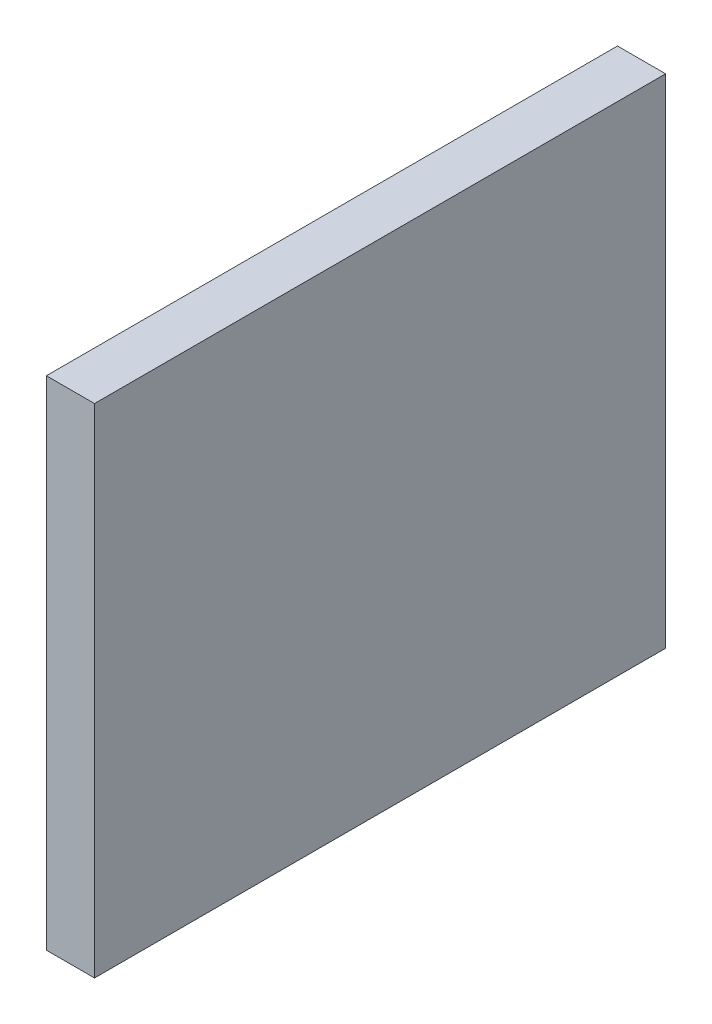
ISO-10303-21;
HEADER;
FILE_DESCRIPTION(('STEP AP214'),'2;1');
FILE_NAME('part.step','',(''),(''),'','','');
FILE_SCHEMA(('AUTOMOTIVE_DESIGN { 1 0 10303 214 1 1 1 1 }'));
ENDSEC;
DATA;
#1=APPLICATION_CONTEXT('core data for automotive mechanical design processes');
#2=APPLICATION_PROTOCOL_DEFINITION('international standard','automotive_design',2000,#1);
#3=PRODUCT_CONTEXT('',#1,'mechanical');
#4=PRODUCT('Part','Part','',(#3));
#5=PRODUCT_RELATED_PRODUCT_CATEGORY('part','',(#4));
#6=PRODUCT_DEFINITION_FORMATION('','',#4);
#7=PRODUCT_DEFINITION_CONTEXT('part definition',#1,'design');
#8=PRODUCT_DEFINITION('design','',#6,#7);
#9=PRODUCT_DEFINITION_SHAPE('','',#8);
#10=(LENGTH_UNIT() NAMED_UNIT(*) SI_UNIT(.MILLI.,.METRE.));
#11=(NAMED_UNIT(*) PLANE_ANGLE_UNIT() SI_UNIT($,.RADIAN.));
#12=(NAMED_UNIT(*) SI_UNIT($,.STERADIAN.) SOLID_ANGLE_UNIT());
#13=UNCERTAINTY_MEASURE_WITH_UNIT(LENGTH_MEASURE(1.E-05),#10,'distance_accuracy_value','');
#14=(GEOMETRIC_REPRESENTATION_CONTEXT(3) GLOBAL_UNCERTAINTY_ASSIGNED_CONTEXT((#13)) GLOBAL_UNIT_ASSIGNED_CONTEXT((#10,
#11,#12)) REPRESENTATION_CONTEXT('',''));
#15=CARTESIAN_POINT('',(0.,0.,0.));
#16=DIRECTION('',(0.,0.,1.));
#17=DIRECTION('',(1.,0.,0.));
#18=AXIS2_PLACEMENT_3D('',#15,#16,#17);
#19=CARTESIAN_POINT('',(0.,0.,0.));
#20=DIRECTION('',(0.,0.,1.));
#21=DIRECTION('',(1.,0.,0.));
#22=AXIS2_PLACEMENT_3D('',#19,#20,#21);
#23=PLANE('',#22);
#24=DIRECTION('',(1.,0.,0.));
#25=VECTOR('',#24,1.);
#26=CARTESIAN_POINT('',(-210.,-250.,0.));
#27=LINE('',#26,#25);
#28=CARTESIAN_POINT('',(-210.,-250.,0.));
#29=VERTEX_POINT('',#28);
#30=CARTESIAN_POINT('',(-190.95,-250.,0.));
#31=VERTEX_POINT('',#30);
#32=EDGE_CURVE('E83',#29,#31,#27,.T.);
#33=ORIENTED_EDGE('',*,*,#32,.F.);
#34=DIRECTION('',(0.,-1.,0.));
#35=VECTOR('',#34,1.);
#36=CARTESIAN_POINT('',(-210.,-53.1314680617709,0.));
#37=LINE('',#36,#35);
#38=CARTESIAN_POINT('',(-210.,-53.1314680617709,0.));
#39=VERTEX_POINT('',#38);
#40=EDGE_CURVE('E94',#39,#29,#37,.T.);
#41=ORIENTED_EDGE('',*,*,#40,.F.);
#42=DIRECTION('',(-1.,0.,0.));
#43=VECTOR('',#42,1.);
#44=CARTESIAN_POINT('',(-190.95,-53.1314680617709,0.));
#45=LINE('',#44,#43);
#46=CARTESIAN_POINT('',(-190.95,-53.1314680617709,0.));
#47=VERTEX_POINT('',#46);
#48=EDGE_CURVE('E85',#47,#39,#45,.T.);
#49=ORIENTED_EDGE('',*,*,#48,.F.);
#50=DIRECTION('',(0.,1.,0.));
#51=VECTOR('',#50,1.);
#52=CARTESIAN_POINT('',(-190.95,-250.,0.));
#53=LINE('',#52,#51);
#54=EDGE_CURVE('E75',#31,#47,#53,.T.);
#55=ORIENTED_EDGE('',*,*,#54,.F.);
#56=EDGE_LOOP('',(#33,#41,#49,#55));
#57=FACE_BOUND('',#56,.T.);
#58=ADVANCED_FACE('F33',(#57),#23,.F.);
#59=CARTESIAN_POINT('',(-210.,-53.1314680617709,423.78807185347));
#60=DIRECTION('',(1.,0.,0.));
#61=DIRECTION('',(0.,1.,0.));
#62=AXIS2_PLACEMENT_3D('',#59,#60,#61);
#63=PLANE('',#62);
#64=DIRECTION('',(0.,0.,-1.));
#65=VECTOR('',#64,1.);
#66=CARTESIAN_POINT('',(-210.,-250.,423.78807185347));
#67=LINE('',#66,#65);
#68=CARTESIAN_POINT('',(-210.,-250.,226.));
#69=VERTEX_POINT('',#68);
#70=EDGE_CURVE('E88',#69,#29,#67,.T.);
#71=ORIENTED_EDGE('',*,*,#70,.F.);
#72=DIRECTION('',(0.,1.,0.));
#73=VECTOR('',#72,1.);
#74=CARTESIAN_POINT('',(-210.,-53.1314680617709,226.));
#75=LINE('',#74,#73);
#76=CARTESIAN_POINT('',(-210.,-53.1314680617709,226.));
#77=VERTEX_POINT('',#76);
#78=EDGE_CURVE('E37',#69,#77,#75,.T.);
#79=ORIENTED_EDGE('',*,*,#78,.T.);
#80=DIRECTION('',(0.,0.,-1.));
#81=VECTOR('',#80,1.);
#82=CARTESIAN_POINT('',(-210.,-53.1314680617709,423.78807185347));
#83=LINE('',#82,#81);
#84=EDGE_CURVE('E97',#77,#39,#83,.T.);
#85=ORIENTED_EDGE('',*,*,#84,.T.);
#86=ORIENTED_EDGE('',*,*,#40,.T.);
#87=EDGE_LOOP('',(#71,#79,#85,#86));
#88=FACE_BOUND('',#87,.T.);
#89=ADVANCED_FACE('F106',(#88),#63,.F.);
#90=CARTESIAN_POINT('',(-190.95,-53.1314680617709,423.78807185347));
#91=DIRECTION('',(0.,-1.,0.));
#92=DIRECTION('',(0.,0.,-1.));
#93=AXIS2_PLACEMENT_3D('',#90,#91,#92);
#94=PLANE('',#93);
#95=ORIENTED_EDGE('',*,*,#84,.F.);
#96=DIRECTION('',(1.,0.,0.));
#97=VECTOR('',#96,1.);
#98=CARTESIAN_POINT('',(-190.95,-53.1314680617709,226.));
#99=LINE('',#98,#97);
#100=CARTESIAN_POINT('',(-190.95,-53.1314680617709,226.));
#101=VERTEX_POINT('',#100);
#102=EDGE_CURVE('E103',#77,#101,#99,.T.);
#103=ORIENTED_EDGE('',*,*,#102,.T.);
#104=DIRECTION('',(0.,0.,-1.));
#105=VECTOR('',#104,1.);
#106=CARTESIAN_POINT('',(-190.95,-53.1314680617709,423.78807185347));
#107=LINE('',#106,#105);
#108=EDGE_CURVE('E79',#101,#47,#107,.T.);
#109=ORIENTED_EDGE('',*,*,#108,.T.);
#110=ORIENTED_EDGE('',*,*,#48,.T.);
#111=EDGE_LOOP('',(#95,#103,#109,#110));
#112=FACE_BOUND('',#111,.T.);
#113=ADVANCED_FACE('F102',(#112),#94,.F.);
#114=CARTESIAN_POINT('',(-190.95,-250.,423.78807185347));
#115=DIRECTION('',(-1.,0.,0.));
#116=DIRECTION('',(0.,0.,1.));
#117=AXIS2_PLACEMENT_3D('',#114,#115,#116);
#118=PLANE('',#117);
#119=ORIENTED_EDGE('',*,*,#108,.F.);
#120=DIRECTION('',(0.,-1.,0.));
#121=VECTOR('',#120,1.);
#122=CARTESIAN_POINT('',(-190.95,-250.,226.));
#123=LINE('',#122,#121);
#124=CARTESIAN_POINT('',(-190.95,-250.,226.));
#125=VERTEX_POINT('',#124);
#126=EDGE_CURVE('E42',#101,#125,#123,.T.);
#127=ORIENTED_EDGE('',*,*,#126,.T.);
#128=DIRECTION('',(0.,0.,-1.));
#129=VECTOR('',#128,1.);
#130=CARTESIAN_POINT('',(-190.95,-250.,423.78807185347));
#131=LINE('',#130,#129);
#132=EDGE_CURVE('E72',#125,#31,#131,.T.);
#133=ORIENTED_EDGE('',*,*,#132,.T.);
#134=ORIENTED_EDGE('',*,*,#54,.T.);
#135=EDGE_LOOP('',(#119,#127,#133,#134));
#136=FACE_BOUND('',#135,.T.);
#137=ADVANCED_FACE('F74',(#136),#118,.F.);
#138=CARTESIAN_POINT('',(-210.,-250.,423.78807185347));
#139=DIRECTION('',(0.,1.,0.));
#140=DIRECTION('',(0.,0.,1.));
#141=AXIS2_PLACEMENT_3D('',#138,#139,#140);
#142=PLANE('',#141);
#143=ORIENTED_EDGE('',*,*,#132,.F.);
#144=DIRECTION('',(-1.,0.,0.));
#145=VECTOR('',#144,1.);
#146=CARTESIAN_POINT('',(-210.,-250.,226.));
#147=LINE('',#146,#145);
#148=EDGE_CURVE('E11',#125,#69,#147,.T.);
#149=ORIENTED_EDGE('',*,*,#148,.T.);
#150=ORIENTED_EDGE('',*,*,#70,.T.);
#151=ORIENTED_EDGE('',*,*,#32,.T.);
#152=EDGE_LOOP('',(#143,#149,#150,#151));
#153=FACE_BOUND('',#152,.T.);
#154=ADVANCED_FACE('F35',(#153),#142,.F.);
#155=CARTESIAN_POINT('',(0.,0.,226.));
#156=DIRECTION('',(0.,0.,-1.));
#157=DIRECTION('',(-1.,0.,0.));
#158=AXIS2_PLACEMENT_3D('',#155,#156,#157);
#159=PLANE('',#158);
#160=ORIENTED_EDGE('',*,*,#126,.F.);
#161=ORIENTED_EDGE('',*,*,#102,.F.);
#162=ORIENTED_EDGE('',*,*,#78,.F.);
#163=ORIENTED_EDGE('',*,*,#148,.F.);
#164=EDGE_LOOP('',(#160,#161,#162,#163));
#165=FACE_BOUND('',#164,.T.);
#166=ADVANCED_FACE('F120',(#165),#159,.F.);
#167=CLOSED_SHELL('',(#58,#89,#113,#137,#154,#166));
#168=MANIFOLD_SOLID_BREP('B2',#167);
#169=ADVANCED_BREP_SHAPE_REPRESENTATION('',(#18,#168),#14);
#170=SHAPE_DEFINITION_REPRESENTATION(#9,#169);
ENDSEC;
END-ISO-10303-21;
